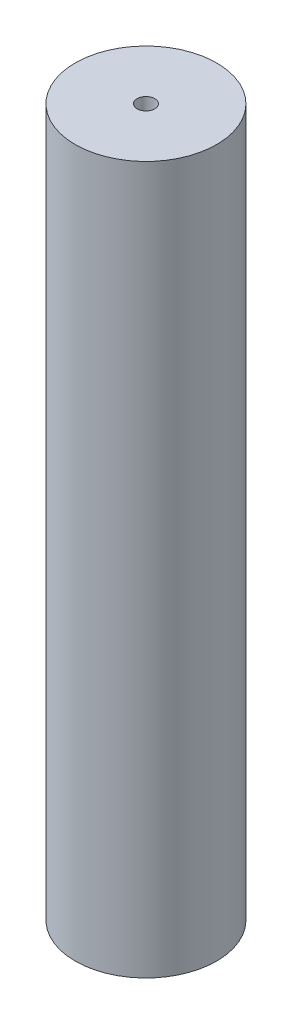
ISO-10303-21;
HEADER;
FILE_DESCRIPTION(('STEP AP214'),'2;1');
FILE_NAME('part.step','',(''),(''),'','','');
FILE_SCHEMA(('AUTOMOTIVE_DESIGN { 1 0 10303 214 1 1 1 1 }'));
ENDSEC;
DATA;
#1=APPLICATION_CONTEXT('core data for automotive mechanical design processes');
#2=APPLICATION_PROTOCOL_DEFINITION('international standard','automotive_design',2000,#1);
#3=PRODUCT_CONTEXT('',#1,'mechanical');
#4=PRODUCT('Part','Part','',(#3));
#5=PRODUCT_RELATED_PRODUCT_CATEGORY('part','',(#4));
#6=PRODUCT_DEFINITION_FORMATION('','',#4);
#7=PRODUCT_DEFINITION_CONTEXT('part definition',#1,'design');
#8=PRODUCT_DEFINITION('design','',#6,#7);
#9=PRODUCT_DEFINITION_SHAPE('','',#8);
#10=(LENGTH_UNIT() NAMED_UNIT(*) SI_UNIT(.MILLI.,.METRE.));
#11=(NAMED_UNIT(*) PLANE_ANGLE_UNIT() SI_UNIT($,.RADIAN.));
#12=(NAMED_UNIT(*) SI_UNIT($,.STERADIAN.) SOLID_ANGLE_UNIT());
#13=UNCERTAINTY_MEASURE_WITH_UNIT(LENGTH_MEASURE(1.E-05),#10,'distance_accuracy_value','');
#14=(GEOMETRIC_REPRESENTATION_CONTEXT(3) GLOBAL_UNCERTAINTY_ASSIGNED_CONTEXT((#13)) GLOBAL_UNIT_ASSIGNED_CONTEXT((#10,
#11,#12)) REPRESENTATION_CONTEXT('',''));
#15=CARTESIAN_POINT('',(0.,0.,0.));
#16=DIRECTION('',(0.,0.,1.));
#17=DIRECTION('',(1.,0.,0.));
#18=AXIS2_PLACEMENT_3D('',#15,#16,#17);
#19=CARTESIAN_POINT('',(0.,200.,0.));
#20=DIRECTION('',(0.,-1.,0.));
#21=DIRECTION('',(0.,0.,-1.));
#22=AXIS2_PLACEMENT_3D('',#19,#20,#21);
#23=CYLINDRICAL_SURFACE('',#22,20.);
#24=CARTESIAN_POINT('',(0.,200.,0.));
#25=DIRECTION('',(0.,1.,0.));
#26=DIRECTION('',(0.,0.,1.));
#27=AXIS2_PLACEMENT_3D('',#24,#25,#26);
#28=CIRCLE('',#27,20.);
#29=CARTESIAN_POINT('',(0.,200.,20.));
#30=VERTEX_POINT('',#29);
#31=EDGE_CURVE('E10',#30,#30,#28,.T.);
#32=ORIENTED_EDGE('',*,*,#31,.F.);
#33=EDGE_LOOP('',(#32));
#34=FACE_BOUND('',#33,.T.);
#35=CARTESIAN_POINT('',(0.,0.,0.));
#36=DIRECTION('',(0.,1.,0.));
#37=DIRECTION('',(0.,0.,1.));
#38=AXIS2_PLACEMENT_3D('',#35,#36,#37);
#39=CIRCLE('',#38,20.);
#40=CARTESIAN_POINT('',(0.,0.,20.));
#41=VERTEX_POINT('',#40);
#42=EDGE_CURVE('E35',#41,#41,#39,.T.);
#43=ORIENTED_EDGE('',*,*,#42,.T.);
#44=EDGE_LOOP('',(#43));
#45=FACE_BOUND('',#44,.T.);
#46=ADVANCED_FACE('F32',(#34,#45),#23,.T.);
#47=CARTESIAN_POINT('',(0.,200.,0.));
#48=DIRECTION('',(0.,1.,0.));
#49=DIRECTION('',(0.,0.,1.));
#50=AXIS2_PLACEMENT_3D('',#47,#48,#49);
#51=PLANE('',#50);
#52=CARTESIAN_POINT('',(0.,200.,0.));
#53=DIRECTION('',(0.,1.,0.));
#54=DIRECTION('',(0.,0.,1.));
#55=AXIS2_PLACEMENT_3D('',#52,#53,#54);
#56=CIRCLE('',#55,2.5);
#57=CARTESIAN_POINT('',(0.,200.,2.5));
#58=VERTEX_POINT('',#57);
#59=EDGE_CURVE('E44',#58,#58,#56,.T.);
#60=ORIENTED_EDGE('',*,*,#59,.F.);
#61=EDGE_LOOP('',(#60));
#62=FACE_BOUND('',#61,.T.);
#63=ORIENTED_EDGE('',*,*,#31,.T.);
#64=EDGE_LOOP('',(#63));
#65=FACE_BOUND('',#64,.T.);
#66=ADVANCED_FACE('F59',(#62,#65),#51,.T.);
#67=CARTESIAN_POINT('',(0.,0.,0.));
#68=DIRECTION('',(0.,1.,0.));
#69=DIRECTION('',(0.,0.,1.));
#70=AXIS2_PLACEMENT_3D('',#67,#68,#69);
#71=PLANE('',#70);
#72=ORIENTED_EDGE('',*,*,#42,.F.);
#73=EDGE_LOOP('',(#72));
#74=FACE_BOUND('',#73,.T.);
#75=ADVANCED_FACE('F55',(#74),#71,.F.);
#76=CARTESIAN_POINT('',(0.,178.,0.));
#77=DIRECTION('',(0.,1.,0.));
#78=DIRECTION('',(0.,0.,1.));
#79=AXIS2_PLACEMENT_3D('',#76,#77,#78);
#80=CYLINDRICAL_SURFACE('',#79,2.5);
#81=CARTESIAN_POINT('',(0.,178.,0.));
#82=DIRECTION('',(0.,1.,0.));
#83=DIRECTION('',(0.,0.,1.));
#84=AXIS2_PLACEMENT_3D('',#81,#82,#83);
#85=CIRCLE('',#84,2.5);
#86=CARTESIAN_POINT('',(0.,178.,2.5));
#87=VERTEX_POINT('',#86);
#88=EDGE_CURVE('E42',#87,#87,#85,.T.);
#89=ORIENTED_EDGE('',*,*,#88,.F.);
#90=EDGE_LOOP('',(#89));
#91=FACE_BOUND('',#90,.T.);
#92=ORIENTED_EDGE('',*,*,#59,.T.);
#93=EDGE_LOOP('',(#92));
#94=FACE_BOUND('',#93,.T.);
#95=ADVANCED_FACE('F52',(#91,#94),#80,.F.);
#96=CARTESIAN_POINT('',(0.,178.,0.));
#97=DIRECTION('',(0.,1.,0.));
#98=DIRECTION('',(0.,0.,1.));
#99=AXIS2_PLACEMENT_3D('',#96,#97,#98);
#100=PLANE('',#99);
#101=ORIENTED_EDGE('',*,*,#88,.T.);
#102=EDGE_LOOP('',(#101));
#103=FACE_BOUND('',#102,.T.);
#104=ADVANCED_FACE('F50',(#103),#100,.T.);
#105=CLOSED_SHELL('',(#46,#66,#75,#95,#104));
#106=MANIFOLD_SOLID_BREP('B2',#105);
#107=ADVANCED_BREP_SHAPE_REPRESENTATION('',(#18,#106),#14);
#108=SHAPE_DEFINITION_REPRESENTATION(#9,#107);
ENDSEC;
END-ISO-10303-21;
